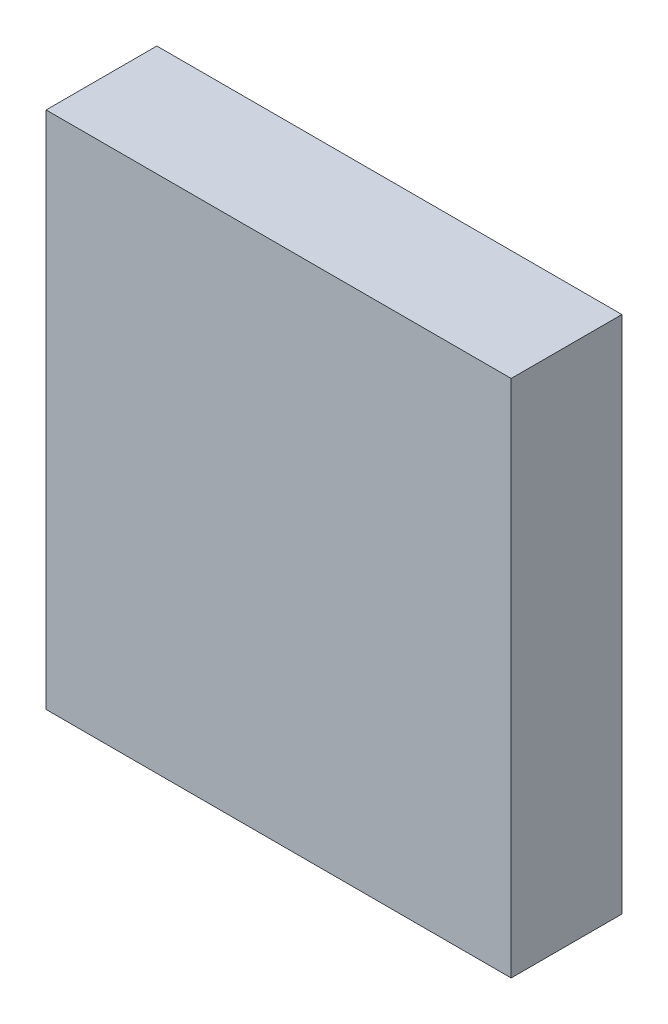
ISO-10303-21;
HEADER;
FILE_DESCRIPTION(('STEP AP214'),'2;1');
FILE_NAME('part.step','',(''),(''),'','','');
FILE_SCHEMA(('AUTOMOTIVE_DESIGN { 1 0 10303 214 1 1 1 1 }'));
ENDSEC;
DATA;
#1=APPLICATION_CONTEXT('core data for automotive mechanical design processes');
#2=APPLICATION_PROTOCOL_DEFINITION('international standard','automotive_design',2000,#1);
#3=PRODUCT_CONTEXT('',#1,'mechanical');
#4=PRODUCT('Part','Part','',(#3));
#5=PRODUCT_RELATED_PRODUCT_CATEGORY('part','',(#4));
#6=PRODUCT_DEFINITION_FORMATION('','',#4);
#7=PRODUCT_DEFINITION_CONTEXT('part definition',#1,'design');
#8=PRODUCT_DEFINITION('design','',#6,#7);
#9=PRODUCT_DEFINITION_SHAPE('','',#8);
#10=(LENGTH_UNIT() NAMED_UNIT(*) SI_UNIT(.MILLI.,.METRE.));
#11=(NAMED_UNIT(*) PLANE_ANGLE_UNIT() SI_UNIT($,.RADIAN.));
#12=(NAMED_UNIT(*) SI_UNIT($,.STERADIAN.) SOLID_ANGLE_UNIT());
#13=UNCERTAINTY_MEASURE_WITH_UNIT(LENGTH_MEASURE(1.E-05),#10,'distance_accuracy_value','');
#14=(GEOMETRIC_REPRESENTATION_CONTEXT(3) GLOBAL_UNCERTAINTY_ASSIGNED_CONTEXT((#13)) GLOBAL_UNIT_ASSIGNED_CONTEXT((#10,
#11,#12)) REPRESENTATION_CONTEXT('',''));
#15=CARTESIAN_POINT('',(0.,0.,0.));
#16=DIRECTION('',(0.,0.,1.));
#17=DIRECTION('',(1.,0.,0.));
#18=AXIS2_PLACEMENT_3D('',#15,#16,#17);
#19=CARTESIAN_POINT('',(0.,0.,65.));
#20=DIRECTION('',(1.,0.,0.));
#21=DIRECTION('',(0.,0.,-1.));
#22=AXIS2_PLACEMENT_3D('',#19,#20,#21);
#23=PLANE('',#22);
#24=DIRECTION('',(0.,-1.,0.));
#25=VECTOR('',#24,1.);
#26=CARTESIAN_POINT('',(0.,0.,0.));
#27=LINE('',#26,#25);
#28=CARTESIAN_POINT('',(0.,304.8,0.));
#29=VERTEX_POINT('',#28);
#30=CARTESIAN_POINT('',(0.,0.,0.));
#31=VERTEX_POINT('',#30);
#32=EDGE_CURVE('E96',#29,#31,#27,.T.);
#33=ORIENTED_EDGE('',*,*,#32,.T.);
#34=DIRECTION('',(0.,0.,-1.));
#35=VECTOR('',#34,1.);
#36=CARTESIAN_POINT('',(0.,0.,65.));
#37=LINE('',#36,#35);
#38=CARTESIAN_POINT('',(0.,0.,65.));
#39=VERTEX_POINT('',#38);
#40=EDGE_CURVE('E11',#39,#31,#37,.T.);
#41=ORIENTED_EDGE('',*,*,#40,.F.);
#42=DIRECTION('',(0.,-1.,0.));
#43=VECTOR('',#42,1.);
#44=CARTESIAN_POINT('',(0.,0.,65.));
#45=LINE('',#44,#43);
#46=CARTESIAN_POINT('',(0.,304.8,65.));
#47=VERTEX_POINT('',#46);
#48=EDGE_CURVE('E84',#47,#39,#45,.T.);
#49=ORIENTED_EDGE('',*,*,#48,.F.);
#50=DIRECTION('',(0.,0.,-1.));
#51=VECTOR('',#50,1.);
#52=CARTESIAN_POINT('',(0.,304.8,65.));
#53=LINE('',#52,#51);
#54=EDGE_CURVE('E92',#47,#29,#53,.T.);
#55=ORIENTED_EDGE('',*,*,#54,.T.);
#56=EDGE_LOOP('',(#33,#41,#49,#55));
#57=FACE_BOUND('',#56,.T.);
#58=ADVANCED_FACE('F33',(#57),#23,.F.);
#59=CARTESIAN_POINT('',(0.,0.,65.));
#60=DIRECTION('',(0.,1.,0.));
#61=DIRECTION('',(0.,0.,1.));
#62=AXIS2_PLACEMENT_3D('',#59,#60,#61);
#63=PLANE('',#62);
#64=DIRECTION('',(1.,0.,0.));
#65=VECTOR('',#64,1.);
#66=CARTESIAN_POINT('',(0.,0.,0.));
#67=LINE('',#66,#65);
#68=CARTESIAN_POINT('',(273.,0.,0.));
#69=VERTEX_POINT('',#68);
#70=EDGE_CURVE('E88',#31,#69,#67,.T.);
#71=ORIENTED_EDGE('',*,*,#70,.T.);
#72=DIRECTION('',(0.,0.,-1.));
#73=VECTOR('',#72,1.);
#74=CARTESIAN_POINT('',(273.,0.,65.));
#75=LINE('',#74,#73);
#76=CARTESIAN_POINT('',(273.,0.,65.));
#77=VERTEX_POINT('',#76);
#78=EDGE_CURVE('E41',#77,#69,#75,.T.);
#79=ORIENTED_EDGE('',*,*,#78,.F.);
#80=DIRECTION('',(1.,0.,0.));
#81=VECTOR('',#80,1.);
#82=CARTESIAN_POINT('',(0.,0.,65.));
#83=LINE('',#82,#81);
#84=EDGE_CURVE('E79',#39,#77,#83,.T.);
#85=ORIENTED_EDGE('',*,*,#84,.F.);
#86=ORIENTED_EDGE('',*,*,#40,.T.);
#87=EDGE_LOOP('',(#71,#79,#85,#86));
#88=FACE_BOUND('',#87,.T.);
#89=ADVANCED_FACE('F87',(#88),#63,.F.);
#90=CARTESIAN_POINT('',(273.,0.,65.));
#91=DIRECTION('',(-1.,0.,0.));
#92=DIRECTION('',(0.,0.,1.));
#93=AXIS2_PLACEMENT_3D('',#90,#91,#92);
#94=PLANE('',#93);
#95=DIRECTION('',(0.,1.,0.));
#96=VECTOR('',#95,1.);
#97=CARTESIAN_POINT('',(273.,0.,0.));
#98=LINE('',#97,#96);
#99=CARTESIAN_POINT('',(273.,304.8,0.));
#100=VERTEX_POINT('',#99);
#101=EDGE_CURVE('E66',#69,#100,#98,.T.);
#102=ORIENTED_EDGE('',*,*,#101,.T.);
#103=DIRECTION('',(0.,0.,-1.));
#104=VECTOR('',#103,1.);
#105=CARTESIAN_POINT('',(273.,304.8,65.));
#106=LINE('',#105,#104);
#107=CARTESIAN_POINT('',(273.,304.8,65.));
#108=VERTEX_POINT('',#107);
#109=EDGE_CURVE('E89',#108,#100,#106,.T.);
#110=ORIENTED_EDGE('',*,*,#109,.F.);
#111=DIRECTION('',(0.,1.,0.));
#112=VECTOR('',#111,1.);
#113=CARTESIAN_POINT('',(273.,0.,65.));
#114=LINE('',#113,#112);
#115=EDGE_CURVE('E82',#77,#108,#114,.T.);
#116=ORIENTED_EDGE('',*,*,#115,.F.);
#117=ORIENTED_EDGE('',*,*,#78,.T.);
#118=EDGE_LOOP('',(#102,#110,#116,#117));
#119=FACE_BOUND('',#118,.T.);
#120=ADVANCED_FACE('F90',(#119),#94,.F.);
#121=CARTESIAN_POINT('',(0.,304.8,65.));
#122=DIRECTION('',(0.,-1.,0.));
#123=DIRECTION('',(0.,0.,-1.));
#124=AXIS2_PLACEMENT_3D('',#121,#122,#123);
#125=PLANE('',#124);
#126=DIRECTION('',(-1.,0.,0.));
#127=VECTOR('',#126,1.);
#128=CARTESIAN_POINT('',(0.,304.8,0.));
#129=LINE('',#128,#127);
#130=EDGE_CURVE('E72',#100,#29,#129,.T.);
#131=ORIENTED_EDGE('',*,*,#130,.T.);
#132=ORIENTED_EDGE('',*,*,#54,.F.);
#133=DIRECTION('',(-1.,0.,0.));
#134=VECTOR('',#133,1.);
#135=CARTESIAN_POINT('',(0.,304.8,65.));
#136=LINE('',#135,#134);
#137=EDGE_CURVE('E49',#108,#47,#136,.T.);
#138=ORIENTED_EDGE('',*,*,#137,.F.);
#139=ORIENTED_EDGE('',*,*,#109,.T.);
#140=EDGE_LOOP('',(#131,#132,#138,#139));
#141=FACE_BOUND('',#140,.T.);
#142=ADVANCED_FACE('F103',(#141),#125,.F.);
#143=CARTESIAN_POINT('',(0.,0.,65.));
#144=DIRECTION('',(0.,0.,-1.));
#145=DIRECTION('',(-1.,0.,0.));
#146=AXIS2_PLACEMENT_3D('',#143,#144,#145);
#147=PLANE('',#146);
#148=ORIENTED_EDGE('',*,*,#48,.T.);
#149=ORIENTED_EDGE('',*,*,#84,.T.);
#150=ORIENTED_EDGE('',*,*,#115,.T.);
#151=ORIENTED_EDGE('',*,*,#137,.T.);
#152=EDGE_LOOP('',(#148,#149,#150,#151));
#153=FACE_BOUND('',#152,.T.);
#154=ADVANCED_FACE('F80',(#153),#147,.F.);
#155=CARTESIAN_POINT('',(0.,0.,0.));
#156=DIRECTION('',(0.,0.,-1.));
#157=DIRECTION('',(-1.,0.,0.));
#158=AXIS2_PLACEMENT_3D('',#155,#156,#157);
#159=PLANE('',#158);
#160=ORIENTED_EDGE('',*,*,#32,.F.);
#161=ORIENTED_EDGE('',*,*,#130,.F.);
#162=ORIENTED_EDGE('',*,*,#101,.F.);
#163=ORIENTED_EDGE('',*,*,#70,.F.);
#164=EDGE_LOOP('',(#160,#161,#162,#163));
#165=FACE_BOUND('',#164,.T.);
#166=ADVANCED_FACE('F106',(#165),#159,.T.);
#167=CLOSED_SHELL('',(#58,#89,#120,#142,#154,#166));
#168=MANIFOLD_SOLID_BREP('B2',#167);
#169=ADVANCED_BREP_SHAPE_REPRESENTATION('',(#18,#168),#14);
#170=SHAPE_DEFINITION_REPRESENTATION(#9,#169);
ENDSEC;
END-ISO-10303-21;
